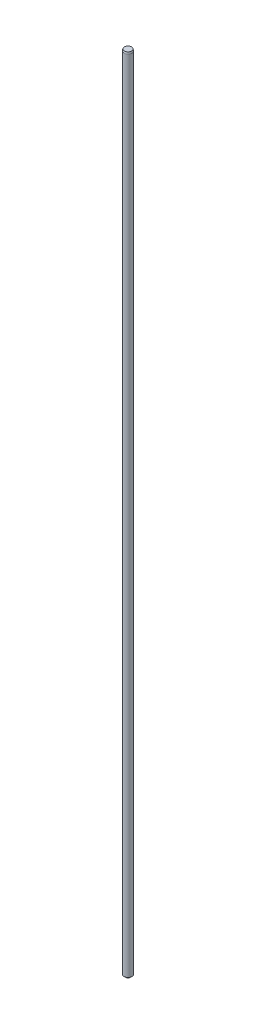
ISO-10303-21;
HEADER;
FILE_DESCRIPTION(('STEP AP214'),'2;1');
FILE_NAME('part.step','',(''),(''),'','','');
FILE_SCHEMA(('AUTOMOTIVE_DESIGN { 1 0 10303 214 1 1 1 1 }'));
ENDSEC;
DATA;
#1=APPLICATION_CONTEXT('core data for automotive mechanical design processes');
#2=APPLICATION_PROTOCOL_DEFINITION('international standard','automotive_design',2000,#1);
#3=PRODUCT_CONTEXT('',#1,'mechanical');
#4=PRODUCT('Part','Part','',(#3));
#5=PRODUCT_RELATED_PRODUCT_CATEGORY('part','',(#4));
#6=PRODUCT_DEFINITION_FORMATION('','',#4);
#7=PRODUCT_DEFINITION_CONTEXT('part definition',#1,'design');
#8=PRODUCT_DEFINITION('design','',#6,#7);
#9=PRODUCT_DEFINITION_SHAPE('','',#8);
#10=(LENGTH_UNIT() NAMED_UNIT(*) SI_UNIT(.MILLI.,.METRE.));
#11=(NAMED_UNIT(*) PLANE_ANGLE_UNIT() SI_UNIT($,.RADIAN.));
#12=(NAMED_UNIT(*) SI_UNIT($,.STERADIAN.) SOLID_ANGLE_UNIT());
#13=UNCERTAINTY_MEASURE_WITH_UNIT(LENGTH_MEASURE(1.E-05),#10,'distance_accuracy_value','');
#14=(GEOMETRIC_REPRESENTATION_CONTEXT(3) GLOBAL_UNCERTAINTY_ASSIGNED_CONTEXT((#13)) GLOBAL_UNIT_ASSIGNED_CONTEXT((#10,
#11,#12)) REPRESENTATION_CONTEXT('',''));
#15=CARTESIAN_POINT('',(0.,0.,0.));
#16=DIRECTION('',(0.,0.,1.));
#17=DIRECTION('',(1.,0.,0.));
#18=AXIS2_PLACEMENT_3D('',#15,#16,#17);
#19=CARTESIAN_POINT('',(0.,4.06004733739965,0.));
#20=DIRECTION('',(0.,1.,0.));
#21=DIRECTION('',(0.,0.,1.));
#22=AXIS2_PLACEMENT_3D('',#19,#20,#21);
#23=CONICAL_SURFACE('',#22,10.,0.785398163397448);
#24=CARTESIAN_POINT('',(0.,0.0600473373992827,0.));
#25=DIRECTION('',(0.,1.,0.));
#26=DIRECTION('',(0.,0.,1.));
#27=AXIS2_PLACEMENT_3D('',#24,#25,#26);
#28=CIRCLE('',#27,5.99999999999963);
#29=CARTESIAN_POINT('',(0.,0.0600473373992827,5.99999999999963));
#30=VERTEX_POINT('',#29);
#31=EDGE_CURVE('E45',#30,#30,#28,.T.);
#32=ORIENTED_EDGE('',*,*,#31,.T.);
#33=EDGE_LOOP('',(#32));
#34=FACE_BOUND('',#33,.T.);
#35=CARTESIAN_POINT('',(0.,4.06004733739965,0.));
#36=DIRECTION('',(0.,1.,0.));
#37=DIRECTION('',(0.,0.,1.));
#38=AXIS2_PLACEMENT_3D('',#35,#36,#37);
#39=CIRCLE('',#38,10.);
#40=CARTESIAN_POINT('',(0.,4.06004733739965,10.));
#41=VERTEX_POINT('',#40);
#42=EDGE_CURVE('E10',#41,#41,#39,.T.);
#43=ORIENTED_EDGE('',*,*,#42,.F.);
#44=EDGE_LOOP('',(#43));
#45=FACE_BOUND('',#44,.T.);
#46=ADVANCED_FACE('F31',(#34,#45),#23,.T.);
#47=CARTESIAN_POINT('',(0.,0.0600473373992827,0.));
#48=DIRECTION('',(0.,1.,0.));
#49=DIRECTION('',(0.,0.,1.));
#50=AXIS2_PLACEMENT_3D('',#47,#48,#49);
#51=CYLINDRICAL_SURFACE('',#50,10.);
#52=ORIENTED_EDGE('',*,*,#42,.T.);
#53=EDGE_LOOP('',(#52));
#54=FACE_BOUND('',#53,.T.);
#55=CARTESIAN_POINT('',(0.,1996.,0.));
#56=DIRECTION('',(0.,1.,0.));
#57=DIRECTION('',(0.,0.,1.));
#58=AXIS2_PLACEMENT_3D('',#55,#56,#57);
#59=CIRCLE('',#58,10.);
#60=CARTESIAN_POINT('',(0.,1996.,10.));
#61=VERTEX_POINT('',#60);
#62=EDGE_CURVE('E37',#61,#61,#59,.T.);
#63=ORIENTED_EDGE('',*,*,#62,.F.);
#64=EDGE_LOOP('',(#63));
#65=FACE_BOUND('',#64,.T.);
#66=ADVANCED_FACE('F64',(#54,#65),#51,.T.);
#67=CARTESIAN_POINT('',(0.,2000.0600473374,0.));
#68=DIRECTION('',(0.,-1.,0.));
#69=DIRECTION('',(0.,0.,-1.));
#70=AXIS2_PLACEMENT_3D('',#67,#68,#69);
#71=CONICAL_SURFACE('',#70,8.99132160526506,0.243509944100265);
#72=ORIENTED_EDGE('',*,*,#62,.T.);
#73=EDGE_LOOP('',(#72));
#74=FACE_BOUND('',#73,.T.);
#75=CARTESIAN_POINT('',(0.,2000.0600473374,0.));
#76=DIRECTION('',(0.,1.,0.));
#77=DIRECTION('',(0.,0.,1.));
#78=AXIS2_PLACEMENT_3D('',#75,#76,#77);
#79=CIRCLE('',#78,8.99132160526506);
#80=CARTESIAN_POINT('',(0.,2000.0600473374,8.99132160526506));
#81=VERTEX_POINT('',#80);
#82=EDGE_CURVE('E41',#81,#81,#79,.T.);
#83=ORIENTED_EDGE('',*,*,#82,.F.);
#84=EDGE_LOOP('',(#83));
#85=FACE_BOUND('',#84,.T.);
#86=ADVANCED_FACE('F60',(#74,#85),#71,.T.);
#87=CARTESIAN_POINT('',(0.,2000.0600473374,0.));
#88=DIRECTION('',(0.,1.,0.));
#89=DIRECTION('',(0.,0.,1.));
#90=AXIS2_PLACEMENT_3D('',#87,#88,#89);
#91=PLANE('',#90);
#92=ORIENTED_EDGE('',*,*,#82,.T.);
#93=EDGE_LOOP('',(#92));
#94=FACE_BOUND('',#93,.T.);
#95=ADVANCED_FACE('F55',(#94),#91,.T.);
#96=CARTESIAN_POINT('',(5.99999999999963,0.0600473373992827,0.));
#97=DIRECTION('',(0.,-1.,0.));
#98=DIRECTION('',(0.,0.,-1.));
#99=AXIS2_PLACEMENT_3D('',#96,#97,#98);
#100=PLANE('',#99);
#101=ORIENTED_EDGE('',*,*,#31,.F.);
#102=EDGE_LOOP('',(#101));
#103=FACE_BOUND('',#102,.T.);
#104=ADVANCED_FACE('F53',(#103),#100,.T.);
#105=CLOSED_SHELL('',(#46,#66,#86,#95,#104));
#106=MANIFOLD_SOLID_BREP('B2',#105);
#107=ADVANCED_BREP_SHAPE_REPRESENTATION('',(#18,#106),#14);
#108=SHAPE_DEFINITION_REPRESENTATION(#9,#107);
ENDSEC;
END-ISO-10303-21;
